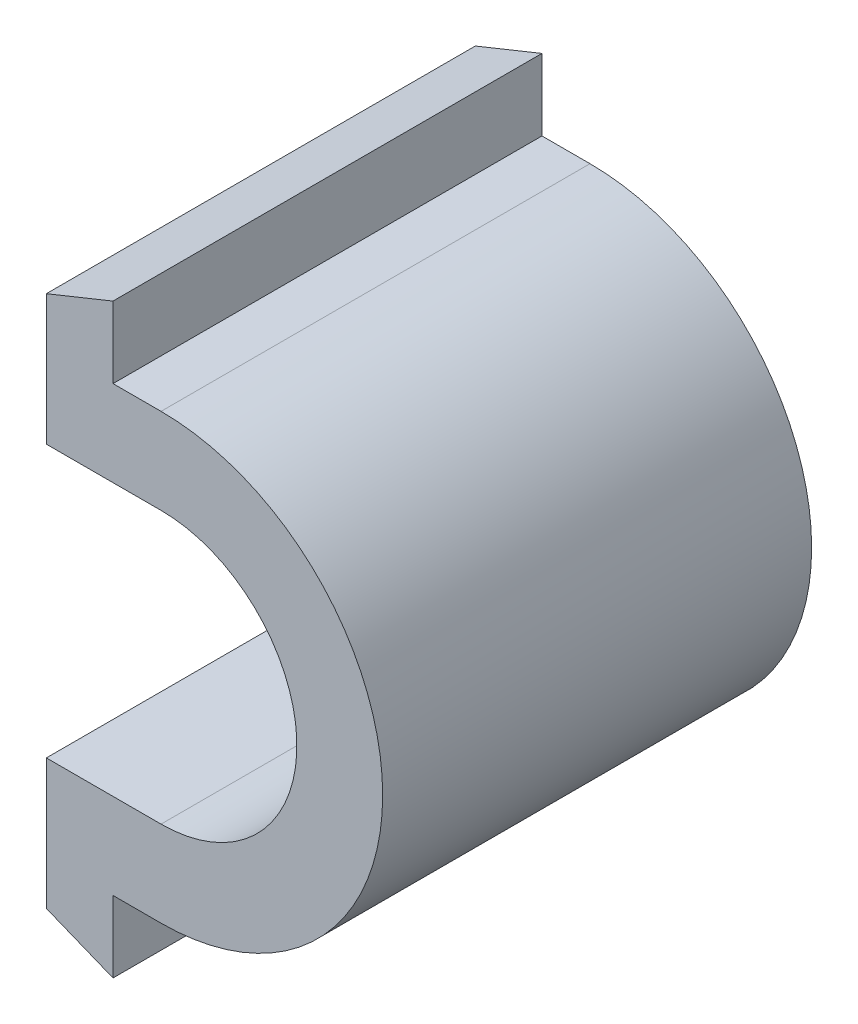
ISO-10303-21;
HEADER;
FILE_DESCRIPTION(('STEP AP214'),'2;1');
FILE_NAME('part.step','',(''),(''),'','','');
FILE_SCHEMA(('AUTOMOTIVE_DESIGN { 1 0 10303 214 1 1 1 1 }'));
ENDSEC;
DATA;
#1=APPLICATION_CONTEXT('core data for automotive mechanical design processes');
#2=APPLICATION_PROTOCOL_DEFINITION('international standard','automotive_design',2000,#1);
#3=PRODUCT_CONTEXT('',#1,'mechanical');
#4=PRODUCT('Part','Part','',(#3));
#5=PRODUCT_RELATED_PRODUCT_CATEGORY('part','',(#4));
#6=PRODUCT_DEFINITION_FORMATION('','',#4);
#7=PRODUCT_DEFINITION_CONTEXT('part definition',#1,'design');
#8=PRODUCT_DEFINITION('design','',#6,#7);
#9=PRODUCT_DEFINITION_SHAPE('','',#8);
#10=(LENGTH_UNIT() NAMED_UNIT(*) SI_UNIT(.MILLI.,.METRE.));
#11=(NAMED_UNIT(*) PLANE_ANGLE_UNIT() SI_UNIT($,.RADIAN.));
#12=(NAMED_UNIT(*) SI_UNIT($,.STERADIAN.) SOLID_ANGLE_UNIT());
#13=UNCERTAINTY_MEASURE_WITH_UNIT(LENGTH_MEASURE(1.E-05),#10,'distance_accuracy_value','');
#14=(GEOMETRIC_REPRESENTATION_CONTEXT(3) GLOBAL_UNCERTAINTY_ASSIGNED_CONTEXT((#13)) GLOBAL_UNIT_ASSIGNED_CONTEXT((#10,
#11,#12)) REPRESENTATION_CONTEXT('',''));
#15=CARTESIAN_POINT('',(0.,0.,0.));
#16=DIRECTION('',(0.,0.,1.));
#17=DIRECTION('',(1.,0.,0.));
#18=AXIS2_PLACEMENT_3D('',#15,#16,#17);
#19=CARTESIAN_POINT('',(0.,3.35648385529832,6.));
#20=DIRECTION('',(1.,0.,0.));
#21=DIRECTION('',(0.,1.,0.));
#22=AXIS2_PLACEMENT_3D('',#19,#20,#21);
#23=PLANE('',#22);
#24=DIRECTION('',(0.,-1.,0.));
#25=VECTOR('',#24,1.);
#26=CARTESIAN_POINT('',(0.,3.35648385529832,0.));
#27=LINE('',#26,#25);
#28=CARTESIAN_POINT('',(0.,3.7234451609196,0.));
#29=VERTEX_POINT('',#28);
#30=CARTESIAN_POINT('',(0.,1.9,0.));
#31=VERTEX_POINT('',#30);
#32=EDGE_CURVE('E97',#29,#31,#27,.T.);
#33=ORIENTED_EDGE('',*,*,#32,.T.);
#34=DIRECTION('',(0.,0.,-1.));
#35=VECTOR('',#34,1.);
#36=CARTESIAN_POINT('',(0.,1.9,6.));
#37=LINE('',#36,#35);
#38=CARTESIAN_POINT('',(0.,1.9,6.));
#39=VERTEX_POINT('',#38);
#40=EDGE_CURVE('E11',#39,#31,#37,.T.);
#41=ORIENTED_EDGE('',*,*,#40,.F.);
#42=DIRECTION('',(0.,-1.,0.));
#43=VECTOR('',#42,1.);
#44=CARTESIAN_POINT('',(0.,3.7234451609196,6.));
#45=LINE('',#44,#43);
#46=CARTESIAN_POINT('',(0.,3.7234451609196,6.));
#47=VERTEX_POINT('',#46);
#48=EDGE_CURVE('E103',#47,#39,#45,.T.);
#49=ORIENTED_EDGE('',*,*,#48,.F.);
#50=DIRECTION('',(0.,0.,-1.));
#51=VECTOR('',#50,1.);
#52=CARTESIAN_POINT('',(0.,3.7234451609196,6.));
#53=LINE('',#52,#51);
#54=EDGE_CURVE('E149',#47,#29,#53,.T.);
#55=ORIENTED_EDGE('',*,*,#54,.T.);
#56=EDGE_LOOP('',(#33,#41,#49,#55));
#57=FACE_BOUND('',#56,.T.);
#58=ADVANCED_FACE('F33',(#57),#23,.F.);
#59=CARTESIAN_POINT('',(0.,1.9,6.));
#60=DIRECTION('',(0.,1.,0.));
#61=DIRECTION('',(0.,0.,1.));
#62=AXIS2_PLACEMENT_3D('',#59,#60,#61);
#63=PLANE('',#62);
#64=DIRECTION('',(1.,0.,0.));
#65=VECTOR('',#64,1.);
#66=CARTESIAN_POINT('',(0.,1.9,0.));
#67=LINE('',#66,#65);
#68=CARTESIAN_POINT('',(1.60416200432468,1.9,0.));
#69=VERTEX_POINT('',#68);
#70=EDGE_CURVE('E154',#31,#69,#67,.T.);
#71=ORIENTED_EDGE('',*,*,#70,.T.);
#72=DIRECTION('',(0.,0.,-1.));
#73=VECTOR('',#72,1.);
#74=CARTESIAN_POINT('',(1.60416200432468,1.9,6.));
#75=LINE('',#74,#73);
#76=CARTESIAN_POINT('',(1.60416200432468,1.9,6.));
#77=VERTEX_POINT('',#76);
#78=EDGE_CURVE('E41',#77,#69,#75,.T.);
#79=ORIENTED_EDGE('',*,*,#78,.F.);
#80=DIRECTION('',(1.,0.,0.));
#81=VECTOR('',#80,1.);
#82=CARTESIAN_POINT('',(0.,1.9,6.));
#83=LINE('',#82,#81);
#84=EDGE_CURVE('E242',#39,#77,#83,.T.);
#85=ORIENTED_EDGE('',*,*,#84,.F.);
#86=ORIENTED_EDGE('',*,*,#40,.T.);
#87=EDGE_LOOP('',(#71,#79,#85,#86));
#88=FACE_BOUND('',#87,.T.);
#89=ADVANCED_FACE('F245',(#88),#63,.F.);
#90=CARTESIAN_POINT('',(1.60416200432468,0.,6.));
#91=DIRECTION('',(0.,0.,-1.));
#92=DIRECTION('',(-1.,0.,0.));
#93=AXIS2_PLACEMENT_3D('',#90,#91,#92);
#94=CYLINDRICAL_SURFACE('',#93,1.9);
#95=CARTESIAN_POINT('',(1.60416200432468,0.,0.));
#96=DIRECTION('',(0.,0.,-1.));
#97=DIRECTION('',(-1.,0.,0.));
#98=AXIS2_PLACEMENT_3D('',#95,#96,#97);
#99=CIRCLE('',#98,1.9);
#100=CARTESIAN_POINT('',(1.60416200432468,-1.9,0.));
#101=VERTEX_POINT('',#100);
#102=EDGE_CURVE('E156',#69,#101,#99,.T.);
#103=ORIENTED_EDGE('',*,*,#102,.T.);
#104=DIRECTION('',(0.,0.,-1.));
#105=VECTOR('',#104,1.);
#106=CARTESIAN_POINT('',(1.60416200432468,-1.9,6.));
#107=LINE('',#106,#105);
#108=CARTESIAN_POINT('',(1.60416200432468,-1.9,6.));
#109=VERTEX_POINT('',#108);
#110=EDGE_CURVE('E194',#109,#101,#107,.T.);
#111=ORIENTED_EDGE('',*,*,#110,.F.);
#112=CARTESIAN_POINT('',(1.60416200432468,0.,6.));
#113=DIRECTION('',(0.,0.,-1.));
#114=DIRECTION('',(-1.,0.,0.));
#115=AXIS2_PLACEMENT_3D('',#112,#113,#114);
#116=CIRCLE('',#115,1.9);
#117=EDGE_CURVE('E203',#77,#109,#116,.T.);
#118=ORIENTED_EDGE('',*,*,#117,.F.);
#119=ORIENTED_EDGE('',*,*,#78,.T.);
#120=EDGE_LOOP('',(#103,#111,#118,#119));
#121=FACE_BOUND('',#120,.T.);
#122=ADVANCED_FACE('F201',(#121),#94,.F.);
#123=CARTESIAN_POINT('',(0.,-1.9,6.));
#124=DIRECTION('',(0.,-1.,0.));
#125=DIRECTION('',(0.,0.,-1.));
#126=AXIS2_PLACEMENT_3D('',#123,#124,#125);
#127=PLANE('',#126);
#128=DIRECTION('',(-1.,0.,0.));
#129=VECTOR('',#128,1.);
#130=CARTESIAN_POINT('',(0.,-1.9,0.));
#131=LINE('',#130,#129);
#132=CARTESIAN_POINT('',(0.,-1.9,0.));
#133=VERTEX_POINT('',#132);
#134=EDGE_CURVE('E158',#101,#133,#131,.T.);
#135=ORIENTED_EDGE('',*,*,#134,.T.);
#136=DIRECTION('',(0.,0.,-1.));
#137=VECTOR('',#136,1.);
#138=CARTESIAN_POINT('',(0.,-1.9,6.));
#139=LINE('',#138,#137);
#140=CARTESIAN_POINT('',(0.,-1.9,6.));
#141=VERTEX_POINT('',#140);
#142=EDGE_CURVE('E191',#141,#133,#139,.T.);
#143=ORIENTED_EDGE('',*,*,#142,.F.);
#144=DIRECTION('',(-1.,0.,0.));
#145=VECTOR('',#144,1.);
#146=CARTESIAN_POINT('',(0.,-1.9,6.));
#147=LINE('',#146,#145);
#148=EDGE_CURVE('E220',#109,#141,#147,.T.);
#149=ORIENTED_EDGE('',*,*,#148,.F.);
#150=ORIENTED_EDGE('',*,*,#110,.T.);
#151=EDGE_LOOP('',(#135,#143,#149,#150));
#152=FACE_BOUND('',#151,.T.);
#153=ADVANCED_FACE('F211',(#152),#127,.F.);
#154=CARTESIAN_POINT('',(0.,-3.7234451609196,6.));
#155=DIRECTION('',(1.,0.,0.));
#156=DIRECTION('',(0.,1.,0.));
#157=AXIS2_PLACEMENT_3D('',#154,#155,#156);
#158=PLANE('',#157);
#159=DIRECTION('',(0.,-1.,0.));
#160=VECTOR('',#159,1.);
#161=CARTESIAN_POINT('',(0.,-3.7234451609196,0.));
#162=LINE('',#161,#160);
#163=CARTESIAN_POINT('',(0.,-3.7234451609196,0.));
#164=VERTEX_POINT('',#163);
#165=EDGE_CURVE('E161',#133,#164,#162,.T.);
#166=ORIENTED_EDGE('',*,*,#165,.T.);
#167=DIRECTION('',(0.,0.,-1.));
#168=VECTOR('',#167,1.);
#169=CARTESIAN_POINT('',(0.,-3.7234451609196,6.));
#170=LINE('',#169,#168);
#171=CARTESIAN_POINT('',(0.,-3.7234451609196,6.));
#172=VERTEX_POINT('',#171);
#173=EDGE_CURVE('E188',#172,#164,#170,.T.);
#174=ORIENTED_EDGE('',*,*,#173,.F.);
#175=DIRECTION('',(0.,-1.,0.));
#176=VECTOR('',#175,1.);
#177=CARTESIAN_POINT('',(0.,-3.35648385529832,6.));
#178=LINE('',#177,#176);
#179=EDGE_CURVE('E217',#141,#172,#178,.T.);
#180=ORIENTED_EDGE('',*,*,#179,.F.);
#181=ORIENTED_EDGE('',*,*,#142,.T.);
#182=EDGE_LOOP('',(#166,#174,#180,#181));
#183=FACE_BOUND('',#182,.T.);
#184=ADVANCED_FACE('F215',(#183),#158,.F.);
#185=CARTESIAN_POINT('',(0.932336103762624,-4.1,6.));
#186=DIRECTION('',(0.374492540287816,0.927229926862145,0.));
#187=DIRECTION('',(-0.927229926862145,0.374492540287816,0.));
#188=AXIS2_PLACEMENT_3D('',#185,#186,#187);
#189=PLANE('',#188);
#190=DIRECTION('',(0.927229926862145,-0.374492540287816,0.));
#191=VECTOR('',#190,1.);
#192=CARTESIAN_POINT('',(0.932336103762624,-4.1,0.));
#193=LINE('',#192,#191);
#194=CARTESIAN_POINT('',(0.932336103762624,-4.1,0.));
#195=VERTEX_POINT('',#194);
#196=EDGE_CURVE('E163',#164,#195,#193,.T.);
#197=ORIENTED_EDGE('',*,*,#196,.T.);
#198=DIRECTION('',(0.,0.,-1.));
#199=VECTOR('',#198,1.);
#200=CARTESIAN_POINT('',(0.932336103762624,-4.1,6.));
#201=LINE('',#200,#199);
#202=CARTESIAN_POINT('',(0.932336103762624,-4.1,6.));
#203=VERTEX_POINT('',#202);
#204=EDGE_CURVE('E185',#203,#195,#201,.T.);
#205=ORIENTED_EDGE('',*,*,#204,.F.);
#206=DIRECTION('',(0.927229926862145,-0.374492540287816,0.));
#207=VECTOR('',#206,1.);
#208=CARTESIAN_POINT('',(0.932336103762624,-4.1,6.));
#209=LINE('',#208,#207);
#210=EDGE_CURVE('E219',#172,#203,#209,.T.);
#211=ORIENTED_EDGE('',*,*,#210,.F.);
#212=ORIENTED_EDGE('',*,*,#173,.T.);
#213=EDGE_LOOP('',(#197,#205,#211,#212));
#214=FACE_BOUND('',#213,.T.);
#215=ADVANCED_FACE('F257',(#214),#189,.F.);
#216=CARTESIAN_POINT('',(0.932336103762624,-3.1,6.));
#217=DIRECTION('',(-1.,0.,0.));
#218=DIRECTION('',(0.,0.,1.));
#219=AXIS2_PLACEMENT_3D('',#216,#217,#218);
#220=PLANE('',#219);
#221=DIRECTION('',(0.,1.,0.));
#222=VECTOR('',#221,1.);
#223=CARTESIAN_POINT('',(0.932336103762624,-3.1,0.));
#224=LINE('',#223,#222);
#225=CARTESIAN_POINT('',(0.932336103762624,-3.1,0.));
#226=VERTEX_POINT('',#225);
#227=EDGE_CURVE('E165',#195,#226,#224,.T.);
#228=ORIENTED_EDGE('',*,*,#227,.T.);
#229=DIRECTION('',(0.,0.,-1.));
#230=VECTOR('',#229,1.);
#231=CARTESIAN_POINT('',(0.932336103762624,-3.1,6.));
#232=LINE('',#231,#230);
#233=CARTESIAN_POINT('',(0.932336103762624,-3.1,6.));
#234=VERTEX_POINT('',#233);
#235=EDGE_CURVE('E182',#234,#226,#232,.T.);
#236=ORIENTED_EDGE('',*,*,#235,.F.);
#237=DIRECTION('',(0.,1.,0.));
#238=VECTOR('',#237,1.);
#239=CARTESIAN_POINT('',(0.932336103762624,-3.1,6.));
#240=LINE('',#239,#238);
#241=EDGE_CURVE('E222',#203,#234,#240,.T.);
#242=ORIENTED_EDGE('',*,*,#241,.F.);
#243=ORIENTED_EDGE('',*,*,#204,.T.);
#244=EDGE_LOOP('',(#228,#236,#242,#243));
#245=FACE_BOUND('',#244,.T.);
#246=ADVANCED_FACE('F260',(#245),#220,.F.);
#247=CARTESIAN_POINT('',(0.932336103762624,-3.1,6.));
#248=DIRECTION('',(0.,1.,0.));
#249=DIRECTION('',(0.,0.,1.));
#250=AXIS2_PLACEMENT_3D('',#247,#248,#249);
#251=PLANE('',#250);
#252=DIRECTION('',(1.,0.,0.));
#253=VECTOR('',#252,1.);
#254=CARTESIAN_POINT('',(0.932336103762624,-3.1,0.));
#255=LINE('',#254,#253);
#256=CARTESIAN_POINT('',(1.60416200432468,-3.1,0.));
#257=VERTEX_POINT('',#256);
#258=EDGE_CURVE('E167',#226,#257,#255,.T.);
#259=ORIENTED_EDGE('',*,*,#258,.T.);
#260=DIRECTION('',(0.,0.,-1.));
#261=VECTOR('',#260,1.);
#262=CARTESIAN_POINT('',(1.60416200432468,-3.1,6.));
#263=LINE('',#262,#261);
#264=CARTESIAN_POINT('',(1.60416200432468,-3.1,6.));
#265=VERTEX_POINT('',#264);
#266=EDGE_CURVE('E179',#265,#257,#263,.T.);
#267=ORIENTED_EDGE('',*,*,#266,.F.);
#268=DIRECTION('',(1.,0.,0.));
#269=VECTOR('',#268,1.);
#270=CARTESIAN_POINT('',(0.932336103762624,-3.1,6.));
#271=LINE('',#270,#269);
#272=EDGE_CURVE('E228',#234,#265,#271,.T.);
#273=ORIENTED_EDGE('',*,*,#272,.F.);
#274=ORIENTED_EDGE('',*,*,#235,.T.);
#275=EDGE_LOOP('',(#259,#267,#273,#274));
#276=FACE_BOUND('',#275,.T.);
#277=ADVANCED_FACE('F234',(#276),#251,.F.);
#278=CARTESIAN_POINT('',(1.60416200432468,0.,6.));
#279=DIRECTION('',(0.,0.,-1.));
#280=DIRECTION('',(-1.,0.,0.));
#281=AXIS2_PLACEMENT_3D('',#278,#279,#280);
#282=CYLINDRICAL_SURFACE('',#281,3.1);
#283=CARTESIAN_POINT('',(1.60416200432468,0.,0.));
#284=DIRECTION('',(0.,0.,1.));
#285=DIRECTION('',(-1.,0.,0.));
#286=AXIS2_PLACEMENT_3D('',#283,#284,#285);
#287=CIRCLE('',#286,3.1);
#288=CARTESIAN_POINT('',(1.60416200432468,3.1,0.));
#289=VERTEX_POINT('',#288);
#290=EDGE_CURVE('E169',#257,#289,#287,.T.);
#291=ORIENTED_EDGE('',*,*,#290,.T.);
#292=DIRECTION('',(0.,0.,-1.));
#293=VECTOR('',#292,1.);
#294=CARTESIAN_POINT('',(1.60416200432468,3.1,6.));
#295=LINE('',#294,#293);
#296=CARTESIAN_POINT('',(1.60416200432468,3.1,6.));
#297=VERTEX_POINT('',#296);
#298=EDGE_CURVE('E144',#297,#289,#295,.T.);
#299=ORIENTED_EDGE('',*,*,#298,.F.);
#300=CARTESIAN_POINT('',(1.60416200432468,0.,6.));
#301=DIRECTION('',(0.,0.,1.));
#302=DIRECTION('',(-1.,0.,0.));
#303=AXIS2_PLACEMENT_3D('',#300,#301,#302);
#304=CIRCLE('',#303,3.1);
#305=EDGE_CURVE('E135',#265,#297,#304,.T.);
#306=ORIENTED_EDGE('',*,*,#305,.F.);
#307=ORIENTED_EDGE('',*,*,#266,.T.);
#308=EDGE_LOOP('',(#291,#299,#306,#307));
#309=FACE_BOUND('',#308,.T.);
#310=ADVANCED_FACE('F238',(#309),#282,.T.);
#311=CARTESIAN_POINT('',(0.932336103762624,3.1,6.));
#312=DIRECTION('',(0.,-1.,0.));
#313=DIRECTION('',(0.,0.,-1.));
#314=AXIS2_PLACEMENT_3D('',#311,#312,#313);
#315=PLANE('',#314);
#316=DIRECTION('',(-1.,0.,0.));
#317=VECTOR('',#316,1.);
#318=CARTESIAN_POINT('',(0.932336103762624,3.1,0.));
#319=LINE('',#318,#317);
#320=CARTESIAN_POINT('',(0.932336103762624,3.1,0.));
#321=VERTEX_POINT('',#320);
#322=EDGE_CURVE('E143',#289,#321,#319,.T.);
#323=ORIENTED_EDGE('',*,*,#322,.T.);
#324=DIRECTION('',(0.,0.,-1.));
#325=VECTOR('',#324,1.);
#326=CARTESIAN_POINT('',(0.932336103762624,3.1,6.));
#327=LINE('',#326,#325);
#328=CARTESIAN_POINT('',(0.932336103762624,3.1,6.));
#329=VERTEX_POINT('',#328);
#330=EDGE_CURVE('E140',#329,#321,#327,.T.);
#331=ORIENTED_EDGE('',*,*,#330,.F.);
#332=DIRECTION('',(-1.,0.,0.));
#333=VECTOR('',#332,1.);
#334=CARTESIAN_POINT('',(0.932336103762624,3.1,6.));
#335=LINE('',#334,#333);
#336=EDGE_CURVE('E129',#297,#329,#335,.T.);
#337=ORIENTED_EDGE('',*,*,#336,.F.);
#338=ORIENTED_EDGE('',*,*,#298,.T.);
#339=EDGE_LOOP('',(#323,#331,#337,#338));
#340=FACE_BOUND('',#339,.T.);
#341=ADVANCED_FACE('F141',(#340),#315,.F.);
#342=CARTESIAN_POINT('',(0.932336103762624,3.1,6.));
#343=DIRECTION('',(-1.,0.,0.));
#344=DIRECTION('',(0.,0.,1.));
#345=AXIS2_PLACEMENT_3D('',#342,#343,#344);
#346=PLANE('',#345);
#347=DIRECTION('',(0.,1.,0.));
#348=VECTOR('',#347,1.);
#349=CARTESIAN_POINT('',(0.932336103762624,3.1,0.));
#350=LINE('',#349,#348);
#351=CARTESIAN_POINT('',(0.932336103762624,4.1,0.));
#352=VERTEX_POINT('',#351);
#353=EDGE_CURVE('E90',#321,#352,#350,.T.);
#354=ORIENTED_EDGE('',*,*,#353,.T.);
#355=DIRECTION('',(0.,0.,-1.));
#356=VECTOR('',#355,1.);
#357=CARTESIAN_POINT('',(0.932336103762624,4.1,6.));
#358=LINE('',#357,#356);
#359=CARTESIAN_POINT('',(0.932336103762624,4.1,6.));
#360=VERTEX_POINT('',#359);
#361=EDGE_CURVE('E145',#360,#352,#358,.T.);
#362=ORIENTED_EDGE('',*,*,#361,.F.);
#363=DIRECTION('',(0.,1.,0.));
#364=VECTOR('',#363,1.);
#365=CARTESIAN_POINT('',(0.932336103762624,3.1,6.));
#366=LINE('',#365,#364);
#367=EDGE_CURVE('E133',#329,#360,#366,.T.);
#368=ORIENTED_EDGE('',*,*,#367,.F.);
#369=ORIENTED_EDGE('',*,*,#330,.T.);
#370=EDGE_LOOP('',(#354,#362,#368,#369));
#371=FACE_BOUND('',#370,.T.);
#372=ADVANCED_FACE('F147',(#371),#346,.F.);
#373=CARTESIAN_POINT('',(0.932336103762624,4.1,6.));
#374=DIRECTION('',(0.374492540287816,-0.927229926862145,0.));
#375=DIRECTION('',(0.927229926862145,0.374492540287816,0.));
#376=AXIS2_PLACEMENT_3D('',#373,#374,#375);
#377=PLANE('',#376);
#378=DIRECTION('',(-0.927229926862145,-0.374492540287816,0.));
#379=VECTOR('',#378,1.);
#380=CARTESIAN_POINT('',(0.932336103762624,4.1,0.));
#381=LINE('',#380,#379);
#382=EDGE_CURVE('E173',#352,#29,#381,.T.);
#383=ORIENTED_EDGE('',*,*,#382,.T.);
#384=ORIENTED_EDGE('',*,*,#54,.F.);
#385=DIRECTION('',(-0.927229926862145,-0.374492540287816,0.));
#386=VECTOR('',#385,1.);
#387=CARTESIAN_POINT('',(0.932336103762624,4.1,6.));
#388=LINE('',#387,#386);
#389=EDGE_CURVE('E49',#360,#47,#388,.T.);
#390=ORIENTED_EDGE('',*,*,#389,.F.);
#391=ORIENTED_EDGE('',*,*,#361,.T.);
#392=EDGE_LOOP('',(#383,#384,#390,#391));
#393=FACE_BOUND('',#392,.T.);
#394=ADVANCED_FACE('F240',(#393),#377,.F.);
#395=CARTESIAN_POINT('',(1.60416200432468,0.,6.));
#396=DIRECTION('',(0.,0.,-1.));
#397=DIRECTION('',(-1.,0.,0.));
#398=AXIS2_PLACEMENT_3D('',#395,#396,#397);
#399=PLANE('',#398);
#400=ORIENTED_EDGE('',*,*,#48,.T.);
#401=ORIENTED_EDGE('',*,*,#84,.T.);
#402=ORIENTED_EDGE('',*,*,#117,.T.);
#403=ORIENTED_EDGE('',*,*,#148,.T.);
#404=ORIENTED_EDGE('',*,*,#179,.T.);
#405=ORIENTED_EDGE('',*,*,#210,.T.);
#406=ORIENTED_EDGE('',*,*,#241,.T.);
#407=ORIENTED_EDGE('',*,*,#272,.T.);
#408=ORIENTED_EDGE('',*,*,#305,.T.);
#409=ORIENTED_EDGE('',*,*,#336,.T.);
#410=ORIENTED_EDGE('',*,*,#367,.T.);
#411=ORIENTED_EDGE('',*,*,#389,.T.);
#412=EDGE_LOOP('',(#400,#401,#402,#403,#404,#405,#406,#407,#408,#409,#410,#411));
#413=FACE_BOUND('',#412,.T.);
#414=ADVANCED_FACE('F131',(#413),#399,.F.);
#415=CARTESIAN_POINT('',(1.60416200432468,0.,0.));
#416=DIRECTION('',(0.,0.,-1.));
#417=DIRECTION('',(-1.,0.,0.));
#418=AXIS2_PLACEMENT_3D('',#415,#416,#417);
#419=PLANE('',#418);
#420=ORIENTED_EDGE('',*,*,#32,.F.);
#421=ORIENTED_EDGE('',*,*,#382,.F.);
#422=ORIENTED_EDGE('',*,*,#353,.F.);
#423=ORIENTED_EDGE('',*,*,#322,.F.);
#424=ORIENTED_EDGE('',*,*,#290,.F.);
#425=ORIENTED_EDGE('',*,*,#258,.F.);
#426=ORIENTED_EDGE('',*,*,#227,.F.);
#427=ORIENTED_EDGE('',*,*,#196,.F.);
#428=ORIENTED_EDGE('',*,*,#165,.F.);
#429=ORIENTED_EDGE('',*,*,#134,.F.);
#430=ORIENTED_EDGE('',*,*,#102,.F.);
#431=ORIENTED_EDGE('',*,*,#70,.F.);
#432=EDGE_LOOP('',(#420,#421,#422,#423,#424,#425,#426,#427,#428,#429,#430,#431));
#433=FACE_BOUND('',#432,.T.);
#434=ADVANCED_FACE('F207',(#433),#419,.T.);
#435=CLOSED_SHELL('',(#58,#89,#122,#153,#184,#215,#246,#277,#310,#341,#372,#394,#414,#434));
#436=MANIFOLD_SOLID_BREP('B2',#435);
#437=ADVANCED_BREP_SHAPE_REPRESENTATION('',(#18,#436),#14);
#438=SHAPE_DEFINITION_REPRESENTATION(#9,#437);
ENDSEC;
END-ISO-10303-21;
